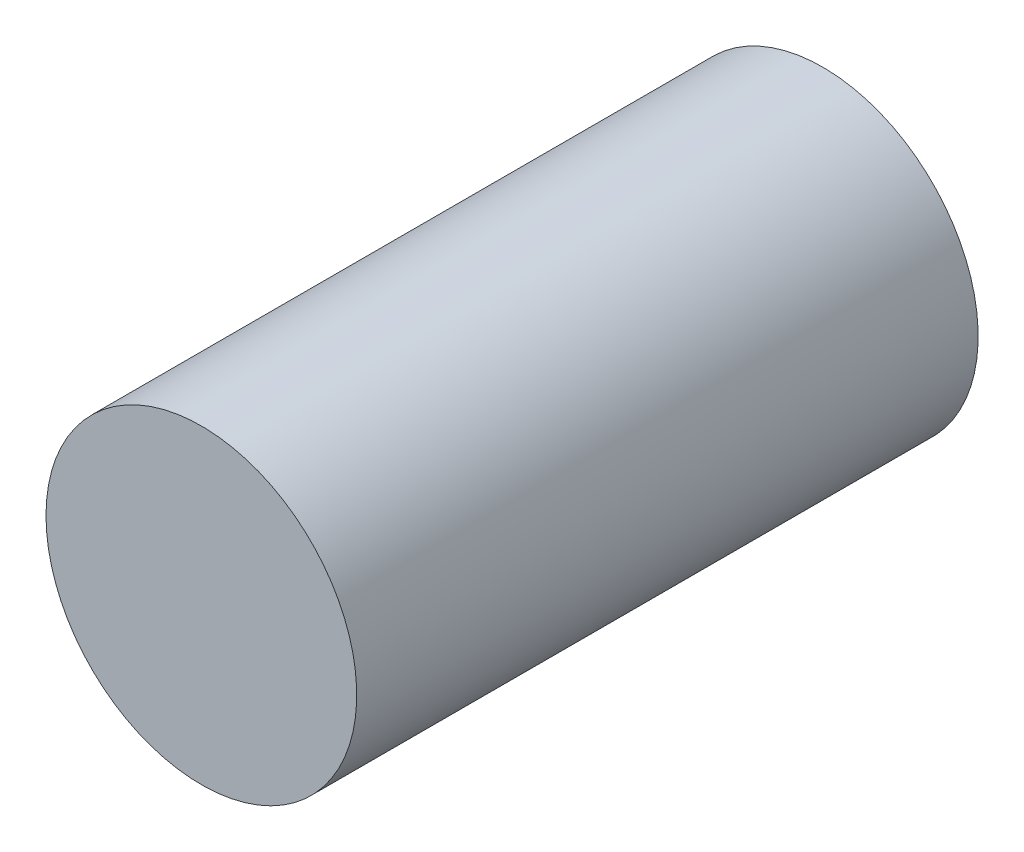
ISO-10303-21;
HEADER;
FILE_DESCRIPTION(('STEP AP214'),'2;1');
FILE_NAME('part.step','',(''),(''),'','','');
FILE_SCHEMA(('AUTOMOTIVE_DESIGN { 1 0 10303 214 1 1 1 1 }'));
ENDSEC;
DATA;
#1=APPLICATION_CONTEXT('core data for automotive mechanical design processes');
#2=APPLICATION_PROTOCOL_DEFINITION('international standard','automotive_design',2000,#1);
#3=PRODUCT_CONTEXT('',#1,'mechanical');
#4=PRODUCT('Part','Part','',(#3));
#5=PRODUCT_RELATED_PRODUCT_CATEGORY('part','',(#4));
#6=PRODUCT_DEFINITION_FORMATION('','',#4);
#7=PRODUCT_DEFINITION_CONTEXT('part definition',#1,'design');
#8=PRODUCT_DEFINITION('design','',#6,#7);
#9=PRODUCT_DEFINITION_SHAPE('','',#8);
#10=(LENGTH_UNIT() NAMED_UNIT(*) SI_UNIT(.MILLI.,.METRE.));
#11=(NAMED_UNIT(*) PLANE_ANGLE_UNIT() SI_UNIT($,.RADIAN.));
#12=(NAMED_UNIT(*) SI_UNIT($,.STERADIAN.) SOLID_ANGLE_UNIT());
#13=UNCERTAINTY_MEASURE_WITH_UNIT(LENGTH_MEASURE(1.E-05),#10,'distance_accuracy_value','');
#14=(GEOMETRIC_REPRESENTATION_CONTEXT(3) GLOBAL_UNCERTAINTY_ASSIGNED_CONTEXT((#13)) GLOBAL_UNIT_ASSIGNED_CONTEXT((#10,
#11,#12)) REPRESENTATION_CONTEXT('',''));
#15=CARTESIAN_POINT('',(0.,0.,0.));
#16=DIRECTION('',(0.,0.,1.));
#17=DIRECTION('',(1.,0.,0.));
#18=AXIS2_PLACEMENT_3D('',#15,#16,#17);
#19=CARTESIAN_POINT('',(0.,0.,38.1));
#20=DIRECTION('',(0.,0.,-1.));
#21=DIRECTION('',(-1.,0.,0.));
#22=AXIS2_PLACEMENT_3D('',#19,#20,#21);
#23=CYLINDRICAL_SURFACE('',#22,9.525);
#24=CARTESIAN_POINT('',(0.,0.,38.1));
#25=DIRECTION('',(0.,0.,1.));
#26=DIRECTION('',(1.,0.,0.));
#27=AXIS2_PLACEMENT_3D('',#24,#25,#26);
#28=CIRCLE('',#27,9.525);
#29=CARTESIAN_POINT('',(-9.525,0.,38.1));
#30=VERTEX_POINT('',#29);
#31=EDGE_CURVE('E10',#30,#30,#28,.T.);
#32=CARTESIAN_POINT('',(0.,0.,0.));
#33=DIRECTION('',(0.,0.,1.));
#34=DIRECTION('',(1.,0.,0.));
#35=AXIS2_PLACEMENT_3D('',#32,#33,#34);
#36=CIRCLE('',#35,9.525);
#37=CARTESIAN_POINT('',(-9.525,0.,0.));
#38=VERTEX_POINT('',#37);
#39=EDGE_CURVE('E46',#38,#38,#36,.T.);
#40=CARTESIAN_POINT('',(-9.525,0.,38.1));
#41=CARTESIAN_POINT('',(-9.525,0.,37.703125));
#42=CARTESIAN_POINT('',(-9.525,0.,37.30625));
#43=CARTESIAN_POINT('',(-9.525,0.,36.5125));
#44=CARTESIAN_POINT('',(-9.525,0.,36.115625));
#45=CARTESIAN_POINT('',(-9.525,0.,35.321875));
#46=CARTESIAN_POINT('',(-9.525,0.,34.925));
#47=CARTESIAN_POINT('',(-9.525,0.,34.13125));
#48=CARTESIAN_POINT('',(-9.525,0.,33.734375));
#49=CARTESIAN_POINT('',(-9.525,0.,32.940625));
#50=CARTESIAN_POINT('',(-9.525,0.,32.54375));
#51=CARTESIAN_POINT('',(-9.525,0.,31.75));
#52=CARTESIAN_POINT('',(-9.525,0.,31.353125));
#53=CARTESIAN_POINT('',(-9.525,0.,30.559375));
#54=CARTESIAN_POINT('',(-9.525,0.,30.1625));
#55=CARTESIAN_POINT('',(-9.525,0.,29.36875));
#56=CARTESIAN_POINT('',(-9.525,0.,28.971875));
#57=CARTESIAN_POINT('',(-9.525,0.,28.178125));
#58=CARTESIAN_POINT('',(-9.525,0.,27.78125));
#59=CARTESIAN_POINT('',(-9.525,0.,26.9875));
#60=CARTESIAN_POINT('',(-9.525,0.,26.590625));
#61=CARTESIAN_POINT('',(-9.525,0.,25.796875));
#62=CARTESIAN_POINT('',(-9.525,0.,25.4));
#63=CARTESIAN_POINT('',(-9.525,0.,24.60625));
#64=CARTESIAN_POINT('',(-9.525,0.,24.209375));
#65=CARTESIAN_POINT('',(-9.525,0.,23.415625));
#66=CARTESIAN_POINT('',(-9.525,0.,23.01875));
#67=CARTESIAN_POINT('',(-9.525,0.,22.225));
#68=CARTESIAN_POINT('',(-9.525,0.,21.828125));
#69=CARTESIAN_POINT('',(-9.525,0.,21.034375));
#70=CARTESIAN_POINT('',(-9.525,0.,20.6375));
#71=CARTESIAN_POINT('',(-9.525,0.,19.84375));
#72=CARTESIAN_POINT('',(-9.525,0.,19.446875));
#73=CARTESIAN_POINT('',(-9.525,0.,18.653125));
#74=CARTESIAN_POINT('',(-9.525,0.,18.25625));
#75=CARTESIAN_POINT('',(-9.525,0.,17.4625));
#76=CARTESIAN_POINT('',(-9.525,0.,17.065625));
#77=CARTESIAN_POINT('',(-9.525,0.,16.271875));
#78=CARTESIAN_POINT('',(-9.525,0.,15.875));
#79=CARTESIAN_POINT('',(-9.525,0.,15.08125));
#80=CARTESIAN_POINT('',(-9.525,0.,14.684375));
#81=CARTESIAN_POINT('',(-9.525,0.,13.890625));
#82=CARTESIAN_POINT('',(-9.525,0.,13.49375));
#83=CARTESIAN_POINT('',(-9.525,0.,12.7));
#84=CARTESIAN_POINT('',(-9.525,0.,12.303125));
#85=CARTESIAN_POINT('',(-9.525,0.,11.509375));
#86=CARTESIAN_POINT('',(-9.525,0.,11.1125));
#87=CARTESIAN_POINT('',(-9.525,0.,10.31875));
#88=CARTESIAN_POINT('',(-9.525,0.,9.92187499999999));
#89=CARTESIAN_POINT('',(-9.525,0.,9.128125));
#90=CARTESIAN_POINT('',(-9.525,0.,8.73124999999999));
#91=CARTESIAN_POINT('',(-9.525,0.,7.93749999999999));
#92=CARTESIAN_POINT('',(-9.525,0.,7.54062499999999));
#93=CARTESIAN_POINT('',(-9.525,0.,6.746875));
#94=CARTESIAN_POINT('',(-9.525,0.,6.35));
#95=CARTESIAN_POINT('',(-9.525,0.,5.55625));
#96=CARTESIAN_POINT('',(-9.525,0.,5.159375));
#97=CARTESIAN_POINT('',(-9.525,0.,4.365625));
#98=CARTESIAN_POINT('',(-9.525,0.,3.96875));
#99=CARTESIAN_POINT('',(-9.525,0.,3.175));
#100=CARTESIAN_POINT('',(-9.525,0.,2.778125));
#101=CARTESIAN_POINT('',(-9.525,0.,1.984375));
#102=CARTESIAN_POINT('',(-9.525,0.,1.5875));
#103=CARTESIAN_POINT('',(-9.525,0.,0.79375));
#104=CARTESIAN_POINT('',(-9.525,0.,0.396875));
#105=CARTESIAN_POINT('',(-9.525,0.,0.));
#106=B_SPLINE_CURVE_WITH_KNOTS('',3,(#40,#41,#42,#43,#44,#45,#46,#47,#48,#49,#50,#51,#52,#53,
#54,#55,#56,#57,#58,#59,#60,#61,#62,#63,#64,#65,#66,#67,#68,#69,#70,#71,#72,#73,#74,#75,#76,#77,
#78,#79,#80,#81,#82,#83,#84,#85,#86,#87,#88,#89,#90,#91,#92,#93,#94,#95,#96,#97,#98,#99,#100,
#101,#102,#103,#104,#105),.UNSPECIFIED.,.F.,.F.,(4,2,2,2,2,2,2,2,2,2,2,2,2,2,2,2,2,2,2,2,2,2,2,
2,2,2,2,2,2,2,2,2,4),(0.,1.190625,2.38125,3.571875,4.7625,5.953125,7.14375,8.334375,
9.52500000000001,10.715625,11.90625,13.096875,14.2875,15.478125,16.66875,17.859375,19.05,
20.240625,21.43125,22.621875,23.8125,25.003125,26.19375,27.384375,28.575,29.765625,30.95625,
32.146875,33.3375,34.528125,35.71875,36.909375,38.1),.UNSPECIFIED.);
#107=EDGE_CURVE('BSEAM43',#30,#38,#106,.T.);
#108=ORIENTED_EDGE('',*,*,#31,.F.);
#109=ORIENTED_EDGE('',*,*,#39,.T.);
#110=ORIENTED_EDGE('',*,*,#107,.T.);
#111=ORIENTED_EDGE('',*,*,#107,.F.);
#112=EDGE_LOOP('',(#108,#110,#109,#111));
#113=FACE_BOUND('',#112,.T.);
#114=ADVANCED_FACE('F43',(#113),#23,.T.);
#115=CARTESIAN_POINT('',(0.,0.,38.1));
#116=DIRECTION('',(0.,0.,1.));
#117=DIRECTION('',(1.,0.,0.));
#118=AXIS2_PLACEMENT_3D('',#115,#116,#117);
#119=PLANE('',#118);
#120=ORIENTED_EDGE('',*,*,#31,.T.);
#121=EDGE_LOOP('',(#120));
#122=FACE_BOUND('',#121,.T.);
#123=ADVANCED_FACE('F58',(#122),#119,.T.);
#124=CARTESIAN_POINT('',(0.,0.,0.));
#125=DIRECTION('',(0.,0.,1.));
#126=DIRECTION('',(1.,0.,0.));
#127=AXIS2_PLACEMENT_3D('',#124,#125,#126);
#128=PLANE('',#127);
#129=ORIENTED_EDGE('',*,*,#39,.F.);
#130=EDGE_LOOP('',(#129));
#131=FACE_BOUND('',#130,.T.);
#132=ADVANCED_FACE('F59',(#131),#128,.F.);
#133=CLOSED_SHELL('',(#114,#123,#132));
#134=MANIFOLD_SOLID_BREP('B2',#133);
#135=ADVANCED_BREP_SHAPE_REPRESENTATION('',(#18,#134),#14);
#136=SHAPE_DEFINITION_REPRESENTATION(#9,#135);
ENDSEC;
END-ISO-10303-21;
